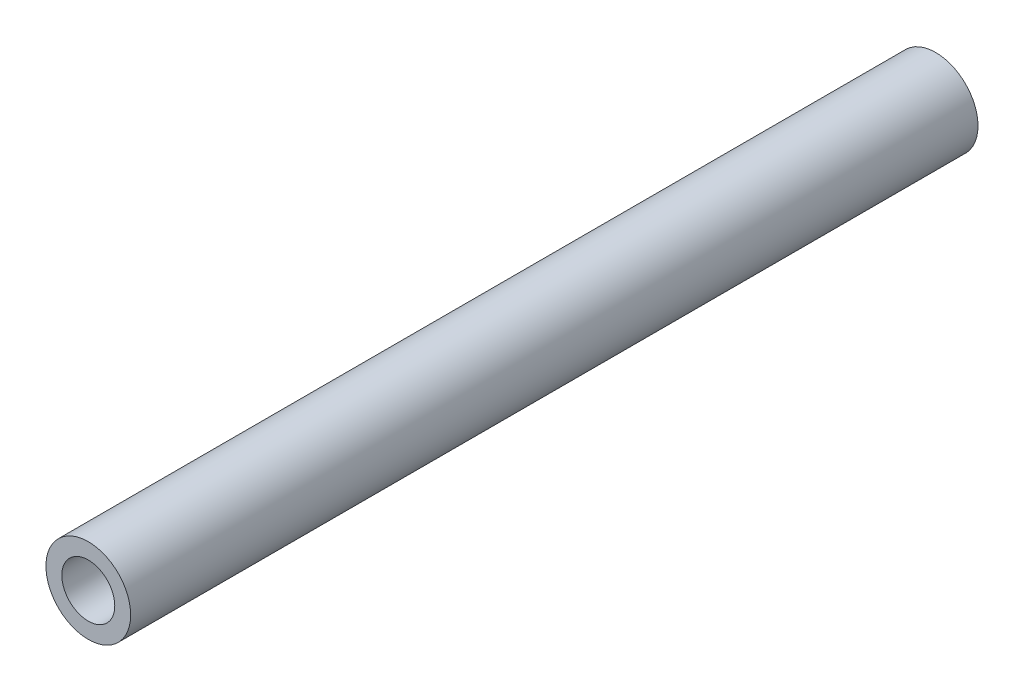
ISO-10303-21;
HEADER;
FILE_DESCRIPTION(('STEP AP214'),'2;1');
FILE_NAME('part.step','',(''),(''),'','','');
FILE_SCHEMA(('AUTOMOTIVE_DESIGN { 1 0 10303 214 1 1 1 1 }'));
ENDSEC;
DATA;
#1=APPLICATION_CONTEXT('core data for automotive mechanical design processes');
#2=APPLICATION_PROTOCOL_DEFINITION('international standard','automotive_design',2000,#1);
#3=PRODUCT_CONTEXT('',#1,'mechanical');
#4=PRODUCT('Part','Part','',(#3));
#5=PRODUCT_RELATED_PRODUCT_CATEGORY('part','',(#4));
#6=PRODUCT_DEFINITION_FORMATION('','',#4);
#7=PRODUCT_DEFINITION_CONTEXT('part definition',#1,'design');
#8=PRODUCT_DEFINITION('design','',#6,#7);
#9=PRODUCT_DEFINITION_SHAPE('','',#8);
#10=(LENGTH_UNIT() NAMED_UNIT(*) SI_UNIT(.MILLI.,.METRE.));
#11=(NAMED_UNIT(*) PLANE_ANGLE_UNIT() SI_UNIT($,.RADIAN.));
#12=(NAMED_UNIT(*) SI_UNIT($,.STERADIAN.) SOLID_ANGLE_UNIT());
#13=UNCERTAINTY_MEASURE_WITH_UNIT(LENGTH_MEASURE(1.E-05),#10,'distance_accuracy_value','');
#14=(GEOMETRIC_REPRESENTATION_CONTEXT(3) GLOBAL_UNCERTAINTY_ASSIGNED_CONTEXT((#13)) GLOBAL_UNIT_ASSIGNED_CONTEXT((#10,
#11,#12)) REPRESENTATION_CONTEXT('',''));
#15=CARTESIAN_POINT('',(0.,0.,0.));
#16=DIRECTION('',(0.,0.,1.));
#17=DIRECTION('',(1.,0.,0.));
#18=AXIS2_PLACEMENT_3D('',#15,#16,#17);
#19=CARTESIAN_POINT('',(0.,0.,80.));
#20=DIRECTION('',(0.,0.,1.));
#21=DIRECTION('',(1.,0.,0.));
#22=AXIS2_PLACEMENT_3D('',#19,#20,#21);
#23=PLANE('',#22);
#24=CARTESIAN_POINT('',(0.,0.,80.));
#25=DIRECTION('',(0.,0.,1.));
#26=DIRECTION('',(1.,0.,0.));
#27=AXIS2_PLACEMENT_3D('',#24,#25,#26);
#28=CIRCLE('',#27,4.);
#29=CARTESIAN_POINT('',(4.,0.,80.));
#30=VERTEX_POINT('',#29);
#31=EDGE_CURVE('E10',#30,#30,#28,.T.);
#32=ORIENTED_EDGE('',*,*,#31,.T.);
#33=EDGE_LOOP('',(#32));
#34=FACE_BOUND('',#33,.T.);
#35=CARTESIAN_POINT('',(0.,0.,80.));
#36=DIRECTION('',(0.,0.,1.));
#37=DIRECTION('',(1.,0.,0.));
#38=AXIS2_PLACEMENT_3D('',#35,#36,#37);
#39=CIRCLE('',#38,2.5);
#40=CARTESIAN_POINT('',(2.5,0.,80.));
#41=VERTEX_POINT('',#40);
#42=EDGE_CURVE('E46',#41,#41,#39,.T.);
#43=ORIENTED_EDGE('',*,*,#42,.F.);
#44=EDGE_LOOP('',(#43));
#45=FACE_BOUND('',#44,.T.);
#46=ADVANCED_FACE('F35',(#34,#45),#23,.T.);
#47=CARTESIAN_POINT('',(0.,0.,0.));
#48=DIRECTION('',(0.,0.,1.));
#49=DIRECTION('',(1.,0.,0.));
#50=AXIS2_PLACEMENT_3D('',#47,#48,#49);
#51=PLANE('',#50);
#52=CARTESIAN_POINT('',(0.,0.,0.));
#53=DIRECTION('',(0.,0.,1.));
#54=DIRECTION('',(1.,0.,0.));
#55=AXIS2_PLACEMENT_3D('',#52,#53,#54);
#56=CIRCLE('',#55,4.);
#57=CARTESIAN_POINT('',(4.,0.,0.));
#58=VERTEX_POINT('',#57);
#59=EDGE_CURVE('E39',#58,#58,#56,.T.);
#60=ORIENTED_EDGE('',*,*,#59,.F.);
#61=EDGE_LOOP('',(#60));
#62=FACE_BOUND('',#61,.T.);
#63=CARTESIAN_POINT('',(0.,0.,0.));
#64=DIRECTION('',(0.,0.,1.));
#65=DIRECTION('',(1.,0.,0.));
#66=AXIS2_PLACEMENT_3D('',#63,#64,#65);
#67=CIRCLE('',#66,2.5);
#68=CARTESIAN_POINT('',(2.5,0.,0.));
#69=VERTEX_POINT('',#68);
#70=EDGE_CURVE('E48',#69,#69,#67,.T.);
#71=ORIENTED_EDGE('',*,*,#70,.T.);
#72=EDGE_LOOP('',(#71));
#73=FACE_BOUND('',#72,.T.);
#74=ADVANCED_FACE('F58',(#62,#73),#51,.F.);
#75=CARTESIAN_POINT('',(0.,0.,80.));
#76=DIRECTION('',(0.,0.,-1.));
#77=DIRECTION('',(-1.,0.,0.));
#78=AXIS2_PLACEMENT_3D('',#75,#76,#77);
#79=CYLINDRICAL_SURFACE('',#78,4.);
#80=ORIENTED_EDGE('',*,*,#31,.F.);
#81=EDGE_LOOP('',(#80));
#82=FACE_BOUND('',#81,.T.);
#83=ORIENTED_EDGE('',*,*,#59,.T.);
#84=EDGE_LOOP('',(#83));
#85=FACE_BOUND('',#84,.T.);
#86=ADVANCED_FACE('F37',(#82,#85),#79,.T.);
#87=CARTESIAN_POINT('',(0.,0.,80.));
#88=DIRECTION('',(0.,0.,-1.));
#89=DIRECTION('',(-1.,0.,0.));
#90=AXIS2_PLACEMENT_3D('',#87,#88,#89);
#91=CYLINDRICAL_SURFACE('',#90,2.5);
#92=ORIENTED_EDGE('',*,*,#42,.T.);
#93=EDGE_LOOP('',(#92));
#94=FACE_BOUND('',#93,.T.);
#95=ORIENTED_EDGE('',*,*,#70,.F.);
#96=EDGE_LOOP('',(#95));
#97=FACE_BOUND('',#96,.T.);
#98=ADVANCED_FACE('F54',(#94,#97),#91,.F.);
#99=CLOSED_SHELL('',(#46,#74,#86,#98));
#100=MANIFOLD_SOLID_BREP('B2',#99);
#101=ADVANCED_BREP_SHAPE_REPRESENTATION('',(#18,#100),#14);
#102=SHAPE_DEFINITION_REPRESENTATION(#9,#101);
ENDSEC;
END-ISO-10303-21;
